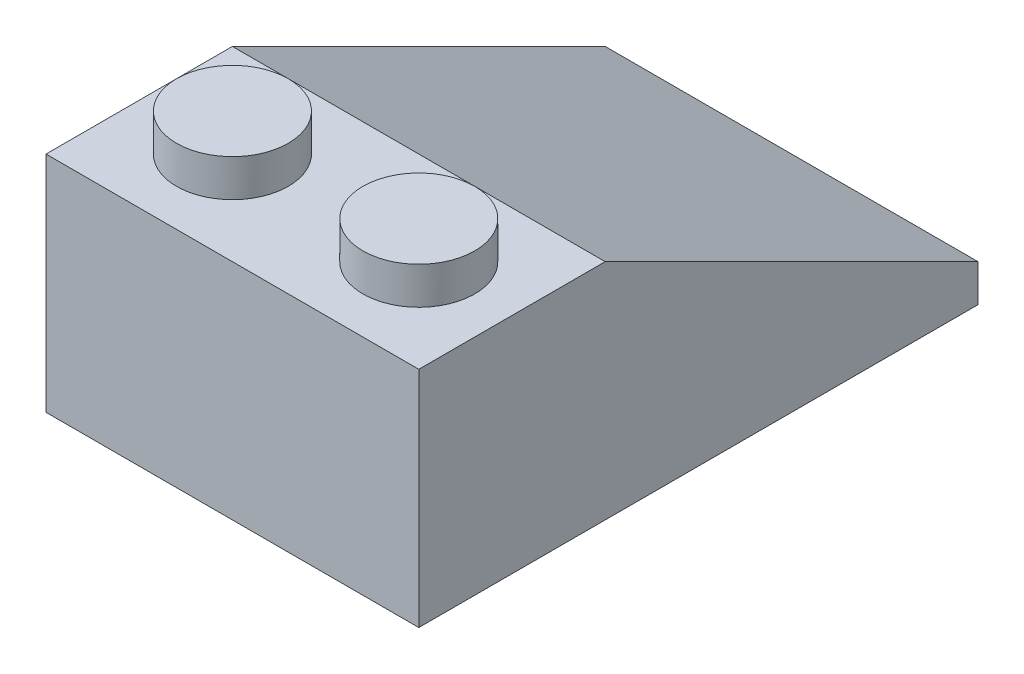
ISO-10303-21;
HEADER;
FILE_DESCRIPTION(('STEP AP214'),'2;1');
FILE_NAME('part.step','',(''),(''),'','','');
FILE_SCHEMA(('AUTOMOTIVE_DESIGN { 1 0 10303 214 1 1 1 1 }'));
ENDSEC;
DATA;
#1=APPLICATION_CONTEXT('core data for automotive mechanical design processes');
#2=APPLICATION_PROTOCOL_DEFINITION('international standard','automotive_design',2000,#1);
#3=PRODUCT_CONTEXT('',#1,'mechanical');
#4=PRODUCT('Part','Part','',(#3));
#5=PRODUCT_RELATED_PRODUCT_CATEGORY('part','',(#4));
#6=PRODUCT_DEFINITION_FORMATION('','',#4);
#7=PRODUCT_DEFINITION_CONTEXT('part definition',#1,'design');
#8=PRODUCT_DEFINITION('design','',#6,#7);
#9=PRODUCT_DEFINITION_SHAPE('','',#8);
#10=(LENGTH_UNIT() NAMED_UNIT(*) SI_UNIT(.MILLI.,.METRE.));
#11=(NAMED_UNIT(*) PLANE_ANGLE_UNIT() SI_UNIT($,.RADIAN.));
#12=(NAMED_UNIT(*) SI_UNIT($,.STERADIAN.) SOLID_ANGLE_UNIT());
#13=UNCERTAINTY_MEASURE_WITH_UNIT(LENGTH_MEASURE(1.E-05),#10,'distance_accuracy_value','');
#14=(GEOMETRIC_REPRESENTATION_CONTEXT(3) GLOBAL_UNCERTAINTY_ASSIGNED_CONTEXT((#13)) GLOBAL_UNIT_ASSIGNED_CONTEXT((#10,
#11,#12)) REPRESENTATION_CONTEXT('',''));
#15=CARTESIAN_POINT('',(0.,0.,0.));
#16=DIRECTION('',(0.,0.,1.));
#17=DIRECTION('',(1.,0.,0.));
#18=AXIS2_PLACEMENT_3D('',#15,#16,#17);
#19=CARTESIAN_POINT('',(16.,0.,0.));
#20=DIRECTION('',(0.,1.,0.));
#21=DIRECTION('',(0.,0.,1.));
#22=AXIS2_PLACEMENT_3D('',#19,#20,#21);
#23=PLANE('',#22);
#24=DIRECTION('',(0.,0.,-1.));
#25=VECTOR('',#24,1.);
#26=CARTESIAN_POINT('',(0.,0.,0.));
#27=LINE('',#26,#25);
#28=CARTESIAN_POINT('',(0.,0.,0.));
#29=VERTEX_POINT('',#28);
#30=CARTESIAN_POINT('',(0.,0.,-24.));
#31=VERTEX_POINT('',#30);
#32=EDGE_CURVE('E137',#29,#31,#27,.T.);
#33=ORIENTED_EDGE('',*,*,#32,.T.);
#34=DIRECTION('',(-1.,0.,0.));
#35=VECTOR('',#34,1.);
#36=CARTESIAN_POINT('',(16.,0.,-24.));
#37=LINE('',#36,#35);
#38=CARTESIAN_POINT('',(16.,0.,-24.));
#39=VERTEX_POINT('',#38);
#40=EDGE_CURVE('E122',#39,#31,#37,.T.);
#41=ORIENTED_EDGE('',*,*,#40,.F.);
#42=DIRECTION('',(0.,0.,-1.));
#43=VECTOR('',#42,1.);
#44=CARTESIAN_POINT('',(16.,0.,0.));
#45=LINE('',#44,#43);
#46=CARTESIAN_POINT('',(16.,0.,0.));
#47=VERTEX_POINT('',#46);
#48=EDGE_CURVE('E97',#47,#39,#45,.T.);
#49=ORIENTED_EDGE('',*,*,#48,.F.);
#50=DIRECTION('',(-1.,0.,0.));
#51=VECTOR('',#50,1.);
#52=CARTESIAN_POINT('',(16.,0.,0.));
#53=LINE('',#52,#51);
#54=EDGE_CURVE('E155',#47,#29,#53,.T.);
#55=ORIENTED_EDGE('',*,*,#54,.T.);
#56=EDGE_LOOP('',(#33,#41,#49,#55));
#57=FACE_BOUND('',#56,.T.);
#58=DIRECTION('',(0.,0.,-1.));
#59=VECTOR('',#58,1.);
#60=CARTESIAN_POINT('',(1.6,0.,0.));
#61=LINE('',#60,#59);
#62=CARTESIAN_POINT('',(1.6,0.,-1.6));
#63=VERTEX_POINT('',#62);
#64=CARTESIAN_POINT('',(1.6,0.,-22.4));
#65=VERTEX_POINT('',#64);
#66=EDGE_CURVE('E373',#63,#65,#61,.T.);
#67=ORIENTED_EDGE('',*,*,#66,.F.);
#68=DIRECTION('',(-1.,0.,0.));
#69=VECTOR('',#68,1.);
#70=CARTESIAN_POINT('',(16.,0.,-1.6));
#71=LINE('',#70,#69);
#72=CARTESIAN_POINT('',(14.4,0.,-1.6));
#73=VERTEX_POINT('',#72);
#74=EDGE_CURVE('E368',#73,#63,#71,.T.);
#75=ORIENTED_EDGE('',*,*,#74,.F.);
#76=DIRECTION('',(0.,0.,-1.));
#77=VECTOR('',#76,1.);
#78=CARTESIAN_POINT('',(14.4,0.,0.));
#79=LINE('',#78,#77);
#80=CARTESIAN_POINT('',(14.4,0.,-22.4));
#81=VERTEX_POINT('',#80);
#82=EDGE_CURVE('E382',#73,#81,#79,.T.);
#83=ORIENTED_EDGE('',*,*,#82,.T.);
#84=DIRECTION('',(-1.,0.,0.));
#85=VECTOR('',#84,1.);
#86=CARTESIAN_POINT('',(16.,0.,-22.4));
#87=LINE('',#86,#85);
#88=EDGE_CURVE('E372',#81,#65,#87,.T.);
#89=ORIENTED_EDGE('',*,*,#88,.T.);
#90=EDGE_LOOP('',(#67,#75,#83,#89));
#91=FACE_BOUND('',#90,.T.);
#92=ADVANCED_FACE('F39',(#57,#91),#23,.F.);
#93=CARTESIAN_POINT('',(16.,9.6,0.));
#94=DIRECTION('',(0.,0.,-1.));
#95=DIRECTION('',(-1.,0.,0.));
#96=AXIS2_PLACEMENT_3D('',#93,#94,#95);
#97=PLANE('',#96);
#98=DIRECTION('',(0.,-1.,0.));
#99=VECTOR('',#98,1.);
#100=CARTESIAN_POINT('',(0.,9.6,0.));
#101=LINE('',#100,#99);
#102=CARTESIAN_POINT('',(0.,9.6,0.));
#103=VERTEX_POINT('',#102);
#104=EDGE_CURVE('E133',#103,#29,#101,.T.);
#105=ORIENTED_EDGE('',*,*,#104,.T.);
#106=ORIENTED_EDGE('',*,*,#54,.F.);
#107=DIRECTION('',(0.,-1.,0.));
#108=VECTOR('',#107,1.);
#109=CARTESIAN_POINT('',(16.,9.6,0.));
#110=LINE('',#109,#108);
#111=CARTESIAN_POINT('',(16.,9.6,0.));
#112=VERTEX_POINT('',#111);
#113=EDGE_CURVE('E148',#112,#47,#110,.T.);
#114=ORIENTED_EDGE('',*,*,#113,.F.);
#115=DIRECTION('',(-1.,0.,0.));
#116=VECTOR('',#115,1.);
#117=CARTESIAN_POINT('',(16.,9.6,0.));
#118=LINE('',#117,#116);
#119=EDGE_CURVE('E129',#112,#103,#118,.T.);
#120=ORIENTED_EDGE('',*,*,#119,.T.);
#121=EDGE_LOOP('',(#105,#106,#114,#120));
#122=FACE_BOUND('',#121,.T.);
#123=ADVANCED_FACE('F41',(#122),#97,.F.);
#124=CARTESIAN_POINT('',(16.,0.,-24.));
#125=DIRECTION('',(0.,0.,1.));
#126=DIRECTION('',(1.,0.,0.));
#127=AXIS2_PLACEMENT_3D('',#124,#125,#126);
#128=PLANE('',#127);
#129=DIRECTION('',(0.,1.,0.));
#130=VECTOR('',#129,1.);
#131=CARTESIAN_POINT('',(0.,0.,-24.));
#132=LINE('',#131,#130);
#133=CARTESIAN_POINT('',(0.,1.6,-24.));
#134=VERTEX_POINT('',#133);
#135=EDGE_CURVE('E118',#31,#134,#132,.T.);
#136=ORIENTED_EDGE('',*,*,#135,.T.);
#137=DIRECTION('',(-1.,0.,0.));
#138=VECTOR('',#137,1.);
#139=CARTESIAN_POINT('',(16.,1.6,-24.));
#140=LINE('',#139,#138);
#141=CARTESIAN_POINT('',(16.,1.6,-24.));
#142=VERTEX_POINT('',#141);
#143=EDGE_CURVE('E115',#142,#134,#140,.T.);
#144=ORIENTED_EDGE('',*,*,#143,.F.);
#145=DIRECTION('',(0.,1.,0.));
#146=VECTOR('',#145,1.);
#147=CARTESIAN_POINT('',(16.,0.,-24.));
#148=LINE('',#147,#146);
#149=EDGE_CURVE('E104',#39,#142,#148,.T.);
#150=ORIENTED_EDGE('',*,*,#149,.F.);
#151=ORIENTED_EDGE('',*,*,#40,.T.);
#152=EDGE_LOOP('',(#136,#144,#150,#151));
#153=FACE_BOUND('',#152,.T.);
#154=ADVANCED_FACE('F116',(#153),#128,.F.);
#155=CARTESIAN_POINT('',(16.,1.6,-24.));
#156=DIRECTION('',(0.,-0.894427190999916,0.447213595499958));
#157=DIRECTION('',(0.,-0.447213595499958,-0.894427190999916));
#158=AXIS2_PLACEMENT_3D('',#155,#156,#157);
#159=PLANE('',#158);
#160=DIRECTION('',(0.,0.447213595499958,0.894427190999916));
#161=VECTOR('',#160,1.);
#162=CARTESIAN_POINT('',(0.,1.6,-24.));
#163=LINE('',#162,#161);
#164=CARTESIAN_POINT('',(0.,9.6,-8.));
#165=VERTEX_POINT('',#164);
#166=EDGE_CURVE('E143',#134,#165,#163,.T.);
#167=ORIENTED_EDGE('',*,*,#166,.T.);
#168=DIRECTION('',(-1.,0.,0.));
#169=VECTOR('',#168,1.);
#170=CARTESIAN_POINT('',(16.,9.6,-8.));
#171=LINE('',#170,#169);
#172=CARTESIAN_POINT('',(16.,9.6,-8.));
#173=VERTEX_POINT('',#172);
#174=EDGE_CURVE('E123',#173,#165,#171,.T.);
#175=ORIENTED_EDGE('',*,*,#174,.F.);
#176=DIRECTION('',(0.,0.447213595499958,0.894427190999916));
#177=VECTOR('',#176,1.);
#178=CARTESIAN_POINT('',(16.,1.6,-24.));
#179=LINE('',#178,#177);
#180=EDGE_CURVE('E108',#142,#173,#179,.T.);
#181=ORIENTED_EDGE('',*,*,#180,.F.);
#182=ORIENTED_EDGE('',*,*,#143,.T.);
#183=EDGE_LOOP('',(#167,#175,#181,#182));
#184=FACE_BOUND('',#183,.T.);
#185=ADVANCED_FACE('F125',(#184),#159,.F.);
#186=CARTESIAN_POINT('',(16.,9.6,-8.));
#187=DIRECTION('',(0.,-1.,0.));
#188=DIRECTION('',(0.,0.,-1.));
#189=AXIS2_PLACEMENT_3D('',#186,#187,#188);
#190=PLANE('',#189);
#191=CARTESIAN_POINT('',(12.,9.6,-4.));
#192=DIRECTION('',(0.,-1.,0.));
#193=DIRECTION('',(0.,0.,-1.));
#194=AXIS2_PLACEMENT_3D('',#191,#192,#193);
#195=CIRCLE('',#194,2.4);
#196=CARTESIAN_POINT('',(12.,9.6,-6.4));
#197=VERTEX_POINT('',#196);
#198=EDGE_CURVE('E11',#197,#197,#195,.F.);
#199=ORIENTED_EDGE('',*,*,#198,.F.);
#200=EDGE_LOOP('',(#199));
#201=FACE_BOUND('',#200,.T.);
#202=CARTESIAN_POINT('',(4.,9.6,-4.));
#203=DIRECTION('',(0.,-1.,0.));
#204=DIRECTION('',(0.,0.,-1.));
#205=AXIS2_PLACEMENT_3D('',#202,#203,#204);
#206=CIRCLE('',#205,2.4);
#207=CARTESIAN_POINT('',(4.,9.6,-6.4));
#208=VERTEX_POINT('',#207);
#209=EDGE_CURVE('E48',#208,#208,#206,.F.);
#210=ORIENTED_EDGE('',*,*,#209,.F.);
#211=EDGE_LOOP('',(#210));
#212=FACE_BOUND('',#211,.T.);
#213=DIRECTION('',(0.,0.,1.));
#214=VECTOR('',#213,1.);
#215=CARTESIAN_POINT('',(0.,9.6,-8.));
#216=LINE('',#215,#214);
#217=EDGE_CURVE('E88',#165,#103,#216,.T.);
#218=ORIENTED_EDGE('',*,*,#217,.T.);
#219=ORIENTED_EDGE('',*,*,#119,.F.);
#220=DIRECTION('',(0.,0.,1.));
#221=VECTOR('',#220,1.);
#222=CARTESIAN_POINT('',(16.,9.6,-8.));
#223=LINE('',#222,#221);
#224=EDGE_CURVE('E64',#173,#112,#223,.T.);
#225=ORIENTED_EDGE('',*,*,#224,.F.);
#226=ORIENTED_EDGE('',*,*,#174,.T.);
#227=EDGE_LOOP('',(#218,#219,#225,#226));
#228=FACE_BOUND('',#227,.T.);
#229=ADVANCED_FACE('F163',(#201,#212,#228),#190,.F.);
#230=CARTESIAN_POINT('',(16.,0.,0.));
#231=DIRECTION('',(1.,0.,0.));
#232=DIRECTION('',(0.,0.,-1.));
#233=AXIS2_PLACEMENT_3D('',#230,#231,#232);
#234=PLANE('',#233);
#235=ORIENTED_EDGE('',*,*,#113,.T.);
#236=ORIENTED_EDGE('',*,*,#48,.T.);
#237=ORIENTED_EDGE('',*,*,#149,.T.);
#238=ORIENTED_EDGE('',*,*,#180,.T.);
#239=ORIENTED_EDGE('',*,*,#224,.T.);
#240=EDGE_LOOP('',(#235,#236,#237,#238,#239));
#241=FACE_BOUND('',#240,.T.);
#242=ADVANCED_FACE('F106',(#241),#234,.T.);
#243=CARTESIAN_POINT('',(0.,0.,0.));
#244=DIRECTION('',(1.,0.,0.));
#245=DIRECTION('',(0.,0.,-1.));
#246=AXIS2_PLACEMENT_3D('',#243,#244,#245);
#247=PLANE('',#246);
#248=ORIENTED_EDGE('',*,*,#104,.F.);
#249=ORIENTED_EDGE('',*,*,#217,.F.);
#250=ORIENTED_EDGE('',*,*,#166,.F.);
#251=ORIENTED_EDGE('',*,*,#135,.F.);
#252=ORIENTED_EDGE('',*,*,#32,.F.);
#253=EDGE_LOOP('',(#248,#249,#250,#251,#252));
#254=FACE_BOUND('',#253,.T.);
#255=ADVANCED_FACE('F171',(#254),#247,.F.);
#256=CARTESIAN_POINT('',(4.,11.2,-4.));
#257=DIRECTION('',(0.,-1.,0.));
#258=DIRECTION('',(0.,0.,-1.));
#259=AXIS2_PLACEMENT_3D('',#256,#257,#258);
#260=CYLINDRICAL_SURFACE('',#259,2.4);
#261=CARTESIAN_POINT('',(4.,11.2,-4.));
#262=DIRECTION('',(0.,1.,0.));
#263=DIRECTION('',(0.,0.,1.));
#264=AXIS2_PLACEMENT_3D('',#261,#262,#263);
#265=CIRCLE('',#264,2.4);
#266=CARTESIAN_POINT('',(4.,11.2,-1.6));
#267=VERTEX_POINT('',#266);
#268=EDGE_CURVE('E138',#267,#267,#265,.T.);
#269=ORIENTED_EDGE('',*,*,#268,.F.);
#270=EDGE_LOOP('',(#269));
#271=FACE_BOUND('',#270,.T.);
#272=ORIENTED_EDGE('',*,*,#209,.T.);
#273=EDGE_LOOP('',(#272));
#274=FACE_BOUND('',#273,.T.);
#275=ADVANCED_FACE('F161',(#271,#274),#260,.T.);
#276=CARTESIAN_POINT('',(4.,11.2,-4.));
#277=DIRECTION('',(0.,1.,0.));
#278=DIRECTION('',(0.,0.,1.));
#279=AXIS2_PLACEMENT_3D('',#276,#277,#278);
#280=PLANE('',#279);
#281=ORIENTED_EDGE('',*,*,#268,.T.);
#282=EDGE_LOOP('',(#281));
#283=FACE_BOUND('',#282,.T.);
#284=ADVANCED_FACE('F219',(#283),#280,.T.);
#285=CARTESIAN_POINT('',(12.,11.2,-4.));
#286=DIRECTION('',(0.,-1.,0.));
#287=DIRECTION('',(0.,0.,-1.));
#288=AXIS2_PLACEMENT_3D('',#285,#286,#287);
#289=CYLINDRICAL_SURFACE('',#288,2.4);
#290=CARTESIAN_POINT('',(12.,11.2,-4.));
#291=DIRECTION('',(0.,1.,0.));
#292=DIRECTION('',(0.,0.,1.));
#293=AXIS2_PLACEMENT_3D('',#290,#291,#292);
#294=CIRCLE('',#293,2.4);
#295=CARTESIAN_POINT('',(12.,11.2,-1.6));
#296=VERTEX_POINT('',#295);
#297=EDGE_CURVE('E387',#296,#296,#294,.T.);
#298=ORIENTED_EDGE('',*,*,#297,.F.);
#299=EDGE_LOOP('',(#298));
#300=FACE_BOUND('',#299,.T.);
#301=ORIENTED_EDGE('',*,*,#198,.T.);
#302=EDGE_LOOP('',(#301));
#303=FACE_BOUND('',#302,.T.);
#304=ADVANCED_FACE('F229',(#300,#303),#289,.T.);
#305=CARTESIAN_POINT('',(12.,11.2,-4.));
#306=DIRECTION('',(0.,1.,0.));
#307=DIRECTION('',(0.,0.,1.));
#308=AXIS2_PLACEMENT_3D('',#305,#306,#307);
#309=PLANE('',#308);
#310=ORIENTED_EDGE('',*,*,#297,.T.);
#311=EDGE_LOOP('',(#310));
#312=FACE_BOUND('',#311,.T.);
#313=ADVANCED_FACE('F239',(#312),#309,.T.);
#314=CARTESIAN_POINT('',(16.,9.6,-1.6));
#315=DIRECTION('',(0.,0.,-1.));
#316=DIRECTION('',(-1.,0.,0.));
#317=AXIS2_PLACEMENT_3D('',#314,#315,#316);
#318=PLANE('',#317);
#319=DIRECTION('',(0.,-1.,0.));
#320=VECTOR('',#319,1.);
#321=CARTESIAN_POINT('',(1.6,9.6,-1.6));
#322=LINE('',#321,#320);
#323=CARTESIAN_POINT('',(1.6,8.,-1.6));
#324=VERTEX_POINT('',#323);
#325=EDGE_CURVE('E364',#324,#63,#322,.T.);
#326=ORIENTED_EDGE('',*,*,#325,.F.);
#327=DIRECTION('',(-1.,0.,0.));
#328=VECTOR('',#327,1.);
#329=CARTESIAN_POINT('',(16.,8.,-1.6));
#330=LINE('',#329,#328);
#331=CARTESIAN_POINT('',(14.4,8.,-1.6));
#332=VERTEX_POINT('',#331);
#333=EDGE_CURVE('E410',#332,#324,#330,.T.);
#334=ORIENTED_EDGE('',*,*,#333,.F.);
#335=DIRECTION('',(0.,-1.,0.));
#336=VECTOR('',#335,1.);
#337=CARTESIAN_POINT('',(14.4,9.6,-1.6));
#338=LINE('',#337,#336);
#339=EDGE_CURVE('E55',#332,#73,#338,.T.);
#340=ORIENTED_EDGE('',*,*,#339,.T.);
#341=ORIENTED_EDGE('',*,*,#74,.T.);
#342=EDGE_LOOP('',(#326,#334,#340,#341));
#343=FACE_BOUND('',#342,.T.);
#344=ADVANCED_FACE('F248',(#343),#318,.T.);
#345=CARTESIAN_POINT('',(16.,0.,-22.4));
#346=DIRECTION('',(0.,0.,1.));
#347=DIRECTION('',(1.,0.,0.));
#348=AXIS2_PLACEMENT_3D('',#345,#346,#347);
#349=PLANE('',#348);
#350=DIRECTION('',(0.,1.,0.));
#351=VECTOR('',#350,1.);
#352=CARTESIAN_POINT('',(1.6,0.,-22.4));
#353=LINE('',#352,#351);
#354=CARTESIAN_POINT('',(1.6,0.611145618000168,-22.4));
#355=VERTEX_POINT('',#354);
#356=EDGE_CURVE('E377',#65,#355,#353,.T.);
#357=ORIENTED_EDGE('',*,*,#356,.F.);
#358=ORIENTED_EDGE('',*,*,#88,.F.);
#359=DIRECTION('',(0.,1.,0.));
#360=VECTOR('',#359,1.);
#361=CARTESIAN_POINT('',(14.4,0.,-22.4));
#362=LINE('',#361,#360);
#363=CARTESIAN_POINT('',(14.4,0.611145618000168,-22.4));
#364=VERTEX_POINT('',#363);
#365=EDGE_CURVE('E386',#81,#364,#362,.T.);
#366=ORIENTED_EDGE('',*,*,#365,.T.);
#367=DIRECTION('',(-1.,0.,0.));
#368=VECTOR('',#367,1.);
#369=CARTESIAN_POINT('',(16.,0.611145618000168,-22.4));
#370=LINE('',#369,#368);
#371=EDGE_CURVE('E381',#364,#355,#370,.T.);
#372=ORIENTED_EDGE('',*,*,#371,.T.);
#373=EDGE_LOOP('',(#357,#358,#366,#372));
#374=FACE_BOUND('',#373,.T.);
#375=ADVANCED_FACE('F263',(#374),#349,.T.);
#376=CARTESIAN_POINT('',(16.,0.168916494400135,-23.2844582472001));
#377=DIRECTION('',(0.,-0.894427190999916,0.447213595499958));
#378=DIRECTION('',(0.,-0.447213595499958,-0.894427190999916));
#379=AXIS2_PLACEMENT_3D('',#376,#377,#378);
#380=PLANE('',#379);
#381=DIRECTION('',(0.,0.447213595499958,0.894427190999916));
#382=VECTOR('',#381,1.);
#383=CARTESIAN_POINT('',(1.6,0.168916494400135,-23.2844582472001));
#384=LINE('',#383,#382);
#385=CARTESIAN_POINT('',(1.6,8.,-7.62229123600034));
#386=VERTEX_POINT('',#385);
#387=EDGE_CURVE('E430',#355,#386,#384,.T.);
#388=ORIENTED_EDGE('',*,*,#387,.F.);
#389=ORIENTED_EDGE('',*,*,#371,.F.);
#390=DIRECTION('',(0.,0.447213595499958,0.894427190999916));
#391=VECTOR('',#390,1.);
#392=CARTESIAN_POINT('',(14.4,0.168916494400135,-23.2844582472001));
#393=LINE('',#392,#391);
#394=CARTESIAN_POINT('',(14.4,8.,-7.62229123600034));
#395=VERTEX_POINT('',#394);
#396=EDGE_CURVE('E418',#364,#395,#393,.T.);
#397=ORIENTED_EDGE('',*,*,#396,.T.);
#398=DIRECTION('',(-1.,0.,0.));
#399=VECTOR('',#398,1.);
#400=CARTESIAN_POINT('',(16.,8.,-7.62229123600034));
#401=LINE('',#400,#399);
#402=EDGE_CURVE('E406',#395,#386,#401,.T.);
#403=ORIENTED_EDGE('',*,*,#402,.T.);
#404=EDGE_LOOP('',(#388,#389,#397,#403));
#405=FACE_BOUND('',#404,.T.);
#406=ADVANCED_FACE('F272',(#405),#380,.T.);
#407=CARTESIAN_POINT('',(16.,8.,-8.));
#408=DIRECTION('',(0.,-1.,0.));
#409=DIRECTION('',(0.,0.,-1.));
#410=AXIS2_PLACEMENT_3D('',#407,#408,#409);
#411=PLANE('',#410);
#412=CARTESIAN_POINT('',(12.,8.,-4.));
#413=DIRECTION('',(0.,-1.,0.));
#414=DIRECTION('',(0.,0.,-1.));
#415=AXIS2_PLACEMENT_3D('',#412,#413,#414);
#416=CIRCLE('',#415,0.799999999999999);
#417=CARTESIAN_POINT('',(12.,8.,-4.8));
#418=VERTEX_POINT('',#417);
#419=EDGE_CURVE('E391',#418,#418,#416,.F.);
#420=ORIENTED_EDGE('',*,*,#419,.T.);
#421=EDGE_LOOP('',(#420));
#422=FACE_BOUND('',#421,.T.);
#423=CARTESIAN_POINT('',(4.,8.,-4.));
#424=DIRECTION('',(0.,-1.,0.));
#425=DIRECTION('',(0.,0.,-1.));
#426=AXIS2_PLACEMENT_3D('',#423,#424,#425);
#427=CIRCLE('',#426,0.799999999999998);
#428=CARTESIAN_POINT('',(4.,8.,-4.8));
#429=VERTEX_POINT('',#428);
#430=EDGE_CURVE('E371',#429,#429,#427,.F.);
#431=ORIENTED_EDGE('',*,*,#430,.T.);
#432=EDGE_LOOP('',(#431));
#433=FACE_BOUND('',#432,.T.);
#434=DIRECTION('',(0.,0.,1.));
#435=VECTOR('',#434,1.);
#436=CARTESIAN_POINT('',(1.6,8.,-8.));
#437=LINE('',#436,#435);
#438=EDGE_CURVE('E426',#386,#324,#437,.T.);
#439=ORIENTED_EDGE('',*,*,#438,.F.);
#440=ORIENTED_EDGE('',*,*,#402,.F.);
#441=DIRECTION('',(0.,0.,1.));
#442=VECTOR('',#441,1.);
#443=CARTESIAN_POINT('',(14.4,8.,-8.));
#444=LINE('',#443,#442);
#445=EDGE_CURVE('E414',#395,#332,#444,.T.);
#446=ORIENTED_EDGE('',*,*,#445,.T.);
#447=ORIENTED_EDGE('',*,*,#333,.T.);
#448=EDGE_LOOP('',(#439,#440,#446,#447));
#449=FACE_BOUND('',#448,.T.);
#450=ADVANCED_FACE('F282',(#422,#433,#449),#411,.T.);
#451=CARTESIAN_POINT('',(14.4,0.,0.));
#452=DIRECTION('',(1.,0.,0.));
#453=DIRECTION('',(0.,0.,-1.));
#454=AXIS2_PLACEMENT_3D('',#451,#452,#453);
#455=PLANE('',#454);
#456=ORIENTED_EDGE('',*,*,#339,.F.);
#457=ORIENTED_EDGE('',*,*,#445,.F.);
#458=ORIENTED_EDGE('',*,*,#396,.F.);
#459=ORIENTED_EDGE('',*,*,#365,.F.);
#460=ORIENTED_EDGE('',*,*,#82,.F.);
#461=EDGE_LOOP('',(#456,#457,#458,#459,#460));
#462=FACE_BOUND('',#461,.T.);
#463=ADVANCED_FACE('F292',(#462),#455,.F.);
#464=CARTESIAN_POINT('',(1.6,0.,0.));
#465=DIRECTION('',(1.,0.,0.));
#466=DIRECTION('',(0.,0.,-1.));
#467=AXIS2_PLACEMENT_3D('',#464,#465,#466);
#468=PLANE('',#467);
#469=ORIENTED_EDGE('',*,*,#325,.T.);
#470=ORIENTED_EDGE('',*,*,#66,.T.);
#471=ORIENTED_EDGE('',*,*,#356,.T.);
#472=ORIENTED_EDGE('',*,*,#387,.T.);
#473=ORIENTED_EDGE('',*,*,#438,.T.);
#474=EDGE_LOOP('',(#469,#470,#471,#472,#473));
#475=FACE_BOUND('',#474,.T.);
#476=ADVANCED_FACE('F302',(#475),#468,.T.);
#477=CARTESIAN_POINT('',(4.,11.2,-4.));
#478=DIRECTION('',(0.,-1.,0.));
#479=DIRECTION('',(0.,0.,-1.));
#480=AXIS2_PLACEMENT_3D('',#477,#478,#479);
#481=CYLINDRICAL_SURFACE('',#480,0.799999999999998);
#482=CARTESIAN_POINT('',(4.,9.6,-4.));
#483=DIRECTION('',(0.,1.,0.));
#484=DIRECTION('',(0.,0.,1.));
#485=AXIS2_PLACEMENT_3D('',#482,#483,#484);
#486=CIRCLE('',#485,0.799999999999998);
#487=CARTESIAN_POINT('',(4.,9.6,-3.2));
#488=VERTEX_POINT('',#487);
#489=EDGE_CURVE('E360',#488,#488,#486,.T.);
#490=ORIENTED_EDGE('',*,*,#489,.T.);
#491=EDGE_LOOP('',(#490));
#492=FACE_BOUND('',#491,.T.);
#493=ORIENTED_EDGE('',*,*,#430,.F.);
#494=EDGE_LOOP('',(#493));
#495=FACE_BOUND('',#494,.T.);
#496=ADVANCED_FACE('F312',(#492,#495),#481,.F.);
#497=CARTESIAN_POINT('',(4.,9.6,-4.));
#498=DIRECTION('',(0.,1.,0.));
#499=DIRECTION('',(0.,0.,1.));
#500=AXIS2_PLACEMENT_3D('',#497,#498,#499);
#501=PLANE('',#500);
#502=ORIENTED_EDGE('',*,*,#489,.F.);
#503=EDGE_LOOP('',(#502));
#504=FACE_BOUND('',#503,.T.);
#505=ADVANCED_FACE('F322',(#504),#501,.F.);
#506=CARTESIAN_POINT('',(12.,11.2,-4.));
#507=DIRECTION('',(0.,-1.,0.));
#508=DIRECTION('',(0.,0.,-1.));
#509=AXIS2_PLACEMENT_3D('',#506,#507,#508);
#510=CYLINDRICAL_SURFACE('',#509,0.799999999999999);
#511=CARTESIAN_POINT('',(12.,9.6,-4.));
#512=DIRECTION('',(0.,1.,0.));
#513=DIRECTION('',(0.,0.,1.));
#514=AXIS2_PLACEMENT_3D('',#511,#512,#513);
#515=CIRCLE('',#514,0.799999999999999);
#516=CARTESIAN_POINT('',(12.,9.6,-3.2));
#517=VERTEX_POINT('',#516);
#518=EDGE_CURVE('E358',#517,#517,#515,.T.);
#519=ORIENTED_EDGE('',*,*,#518,.T.);
#520=EDGE_LOOP('',(#519));
#521=FACE_BOUND('',#520,.T.);
#522=ORIENTED_EDGE('',*,*,#419,.F.);
#523=EDGE_LOOP('',(#522));
#524=FACE_BOUND('',#523,.T.);
#525=ADVANCED_FACE('F332',(#521,#524),#510,.F.);
#526=CARTESIAN_POINT('',(12.,9.6,-4.));
#527=DIRECTION('',(0.,1.,0.));
#528=DIRECTION('',(0.,0.,1.));
#529=AXIS2_PLACEMENT_3D('',#526,#527,#528);
#530=PLANE('',#529);
#531=ORIENTED_EDGE('',*,*,#518,.F.);
#532=EDGE_LOOP('',(#531));
#533=FACE_BOUND('',#532,.T.);
#534=ADVANCED_FACE('F342',(#533),#530,.F.);
#535=CLOSED_SHELL('',(#92,#123,#154,#185,#229,#242,#255,#275,#284,#304,#313,#344,#375,#406,#450,
#463,#476,#496,#505,#525,#534));
#536=MANIFOLD_SOLID_BREP('B2',#535);
#537=ADVANCED_BREP_SHAPE_REPRESENTATION('',(#18,#536),#14);
#538=SHAPE_DEFINITION_REPRESENTATION(#9,#537);
ENDSEC;
END-ISO-10303-21;
